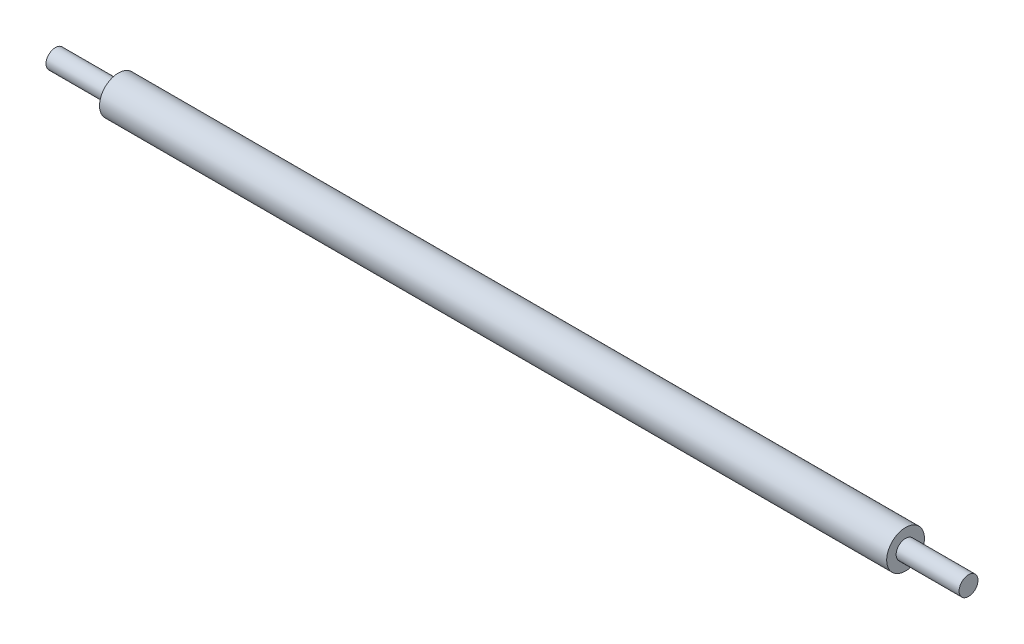
ISO-10303-21;
HEADER;
FILE_DESCRIPTION(('STEP AP214'),'2;1');
FILE_NAME('part.step','',(''),(''),'','','');
FILE_SCHEMA(('AUTOMOTIVE_DESIGN { 1 0 10303 214 1 1 1 1 }'));
ENDSEC;
DATA;
#1=APPLICATION_CONTEXT('core data for automotive mechanical design processes');
#2=APPLICATION_PROTOCOL_DEFINITION('international standard','automotive_design',2000,#1);
#3=PRODUCT_CONTEXT('',#1,'mechanical');
#4=PRODUCT('Part','Part','',(#3));
#5=PRODUCT_RELATED_PRODUCT_CATEGORY('part','',(#4));
#6=PRODUCT_DEFINITION_FORMATION('','',#4);
#7=PRODUCT_DEFINITION_CONTEXT('part definition',#1,'design');
#8=PRODUCT_DEFINITION('design','',#6,#7);
#9=PRODUCT_DEFINITION_SHAPE('','',#8);
#10=(LENGTH_UNIT() NAMED_UNIT(*) SI_UNIT(.MILLI.,.METRE.));
#11=(NAMED_UNIT(*) PLANE_ANGLE_UNIT() SI_UNIT($,.RADIAN.));
#12=(NAMED_UNIT(*) SI_UNIT($,.STERADIAN.) SOLID_ANGLE_UNIT());
#13=UNCERTAINTY_MEASURE_WITH_UNIT(LENGTH_MEASURE(1.E-05),#10,'distance_accuracy_value','');
#14=(GEOMETRIC_REPRESENTATION_CONTEXT(3) GLOBAL_UNCERTAINTY_ASSIGNED_CONTEXT((#13)) GLOBAL_UNIT_ASSIGNED_CONTEXT((#10,
#11,#12)) REPRESENTATION_CONTEXT('',''));
#15=CARTESIAN_POINT('',(0.,0.,0.));
#16=DIRECTION('',(0.,0.,1.));
#17=DIRECTION('',(1.,0.,0.));
#18=AXIS2_PLACEMENT_3D('',#15,#16,#17);
#19=CARTESIAN_POINT('',(-65.,0.,0.));
#20=DIRECTION('',(1.,0.,0.));
#21=DIRECTION('',(0.,0.,-1.));
#22=AXIS2_PLACEMENT_3D('',#19,#20,#21);
#23=PLANE('',#22);
#24=CARTESIAN_POINT('',(-65.,0.,-3.));
#25=DIRECTION('',(1.,0.,0.));
#26=DIRECTION('',(0.,0.,-1.));
#27=AXIS2_PLACEMENT_3D('',#24,#25,#26);
#28=CIRCLE('',#27,3.00000000000001);
#29=CARTESIAN_POINT('',(-65.,0.,-6.00000000000001));
#30=VERTEX_POINT('',#29);
#31=EDGE_CURVE('E10',#30,#30,#28,.T.);
#32=ORIENTED_EDGE('',*,*,#31,.F.);
#33=EDGE_LOOP('',(#32));
#34=FACE_BOUND('',#33,.T.);
#35=CARTESIAN_POINT('',(-65.,0.,-3.));
#36=DIRECTION('',(1.,0.,0.));
#37=DIRECTION('',(0.,0.,-1.));
#38=AXIS2_PLACEMENT_3D('',#35,#36,#37);
#39=CIRCLE('',#38,1.5);
#40=CARTESIAN_POINT('',(-65.,0.,-4.5));
#41=VERTEX_POINT('',#40);
#42=EDGE_CURVE('E37',#41,#41,#39,.T.);
#43=ORIENTED_EDGE('',*,*,#42,.T.);
#44=EDGE_LOOP('',(#43));
#45=FACE_BOUND('',#44,.T.);
#46=ADVANCED_FACE('F31',(#34,#45),#23,.F.);
#47=CARTESIAN_POINT('',(70.,0.,-3.));
#48=DIRECTION('',(1.,0.,0.));
#49=DIRECTION('',(0.,0.,-1.));
#50=AXIS2_PLACEMENT_3D('',#47,#48,#49);
#51=CYLINDRICAL_SURFACE('',#50,1.5);
#52=ORIENTED_EDGE('',*,*,#42,.F.);
#53=EDGE_LOOP('',(#52));
#54=FACE_BOUND('',#53,.T.);
#55=CARTESIAN_POINT('',(-75.,0.,-3.));
#56=DIRECTION('',(1.,0.,0.));
#57=DIRECTION('',(0.,0.,-1.));
#58=AXIS2_PLACEMENT_3D('',#55,#56,#57);
#59=CIRCLE('',#58,1.5);
#60=CARTESIAN_POINT('',(-75.,0.,-4.5));
#61=VERTEX_POINT('',#60);
#62=EDGE_CURVE('E41',#61,#61,#59,.T.);
#63=ORIENTED_EDGE('',*,*,#62,.T.);
#64=EDGE_LOOP('',(#63));
#65=FACE_BOUND('',#64,.T.);
#66=ADVANCED_FACE('F69',(#54,#65),#51,.T.);
#67=CARTESIAN_POINT('',(-75.,0.,-1.5));
#68=DIRECTION('',(1.,0.,0.));
#69=DIRECTION('',(0.,0.,-1.));
#70=AXIS2_PLACEMENT_3D('',#67,#68,#69);
#71=PLANE('',#70);
#72=ORIENTED_EDGE('',*,*,#62,.F.);
#73=EDGE_LOOP('',(#72));
#74=FACE_BOUND('',#73,.T.);
#75=ADVANCED_FACE('F74',(#74),#71,.F.);
#76=CARTESIAN_POINT('',(70.,0.,-1.5));
#77=DIRECTION('',(-1.,0.,0.));
#78=DIRECTION('',(0.,0.,1.));
#79=AXIS2_PLACEMENT_3D('',#76,#77,#78);
#80=PLANE('',#79);
#81=CARTESIAN_POINT('',(70.,0.,-3.));
#82=DIRECTION('',(1.,0.,0.));
#83=DIRECTION('',(0.,0.,-1.));
#84=AXIS2_PLACEMENT_3D('',#81,#82,#83);
#85=CIRCLE('',#84,1.5);
#86=CARTESIAN_POINT('',(70.,0.,-4.5));
#87=VERTEX_POINT('',#86);
#88=EDGE_CURVE('E45',#87,#87,#85,.T.);
#89=ORIENTED_EDGE('',*,*,#88,.T.);
#90=EDGE_LOOP('',(#89));
#91=FACE_BOUND('',#90,.T.);
#92=ADVANCED_FACE('F79',(#91),#80,.F.);
#93=CARTESIAN_POINT('',(70.,0.,-3.));
#94=DIRECTION('',(1.,0.,0.));
#95=DIRECTION('',(0.,0.,-1.));
#96=AXIS2_PLACEMENT_3D('',#93,#94,#95);
#97=CYLINDRICAL_SURFACE('',#96,1.5);
#98=ORIENTED_EDGE('',*,*,#88,.F.);
#99=EDGE_LOOP('',(#98));
#100=FACE_BOUND('',#99,.T.);
#101=CARTESIAN_POINT('',(60.,0.,-3.));
#102=DIRECTION('',(1.,0.,0.));
#103=DIRECTION('',(0.,0.,-1.));
#104=AXIS2_PLACEMENT_3D('',#101,#102,#103);
#105=CIRCLE('',#104,1.5);
#106=CARTESIAN_POINT('',(60.,0.,-4.5));
#107=VERTEX_POINT('',#106);
#108=EDGE_CURVE('E50',#107,#107,#105,.T.);
#109=ORIENTED_EDGE('',*,*,#108,.T.);
#110=EDGE_LOOP('',(#109));
#111=FACE_BOUND('',#110,.T.);
#112=ADVANCED_FACE('F65',(#100,#111),#97,.T.);
#113=CARTESIAN_POINT('',(60.,0.,0.));
#114=DIRECTION('',(-1.,0.,0.));
#115=DIRECTION('',(0.,0.,1.));
#116=AXIS2_PLACEMENT_3D('',#113,#114,#115);
#117=PLANE('',#116);
#118=ORIENTED_EDGE('',*,*,#108,.F.);
#119=EDGE_LOOP('',(#118));
#120=FACE_BOUND('',#119,.T.);
#121=CARTESIAN_POINT('',(60.,0.,-3.));
#122=DIRECTION('',(1.,0.,0.));
#123=DIRECTION('',(0.,0.,-1.));
#124=AXIS2_PLACEMENT_3D('',#121,#122,#123);
#125=CIRCLE('',#124,3.);
#126=CARTESIAN_POINT('',(60.,0.,-6.));
#127=VERTEX_POINT('',#126);
#128=EDGE_CURVE('E53',#127,#127,#125,.T.);
#129=ORIENTED_EDGE('',*,*,#128,.T.);
#130=EDGE_LOOP('',(#129));
#131=FACE_BOUND('',#130,.T.);
#132=ADVANCED_FACE('F57',(#120,#131),#117,.F.);
#133=CARTESIAN_POINT('',(70.,0.,-3.));
#134=DIRECTION('',(1.,0.,0.));
#135=DIRECTION('',(0.,0.,-1.));
#136=AXIS2_PLACEMENT_3D('',#133,#134,#135);
#137=CYLINDRICAL_SURFACE('',#136,3.);
#138=ORIENTED_EDGE('',*,*,#128,.F.);
#139=EDGE_LOOP('',(#138));
#140=FACE_BOUND('',#139,.T.);
#141=ORIENTED_EDGE('',*,*,#31,.T.);
#142=EDGE_LOOP('',(#141));
#143=FACE_BOUND('',#142,.T.);
#144=ADVANCED_FACE('F59',(#140,#143),#137,.T.);
#145=CLOSED_SHELL('',(#46,#66,#75,#92,#112,#132,#144));
#146=MANIFOLD_SOLID_BREP('B2',#145);
#147=ADVANCED_BREP_SHAPE_REPRESENTATION('',(#18,#146),#14);
#148=SHAPE_DEFINITION_REPRESENTATION(#9,#147);
ENDSEC;
END-ISO-10303-21;
